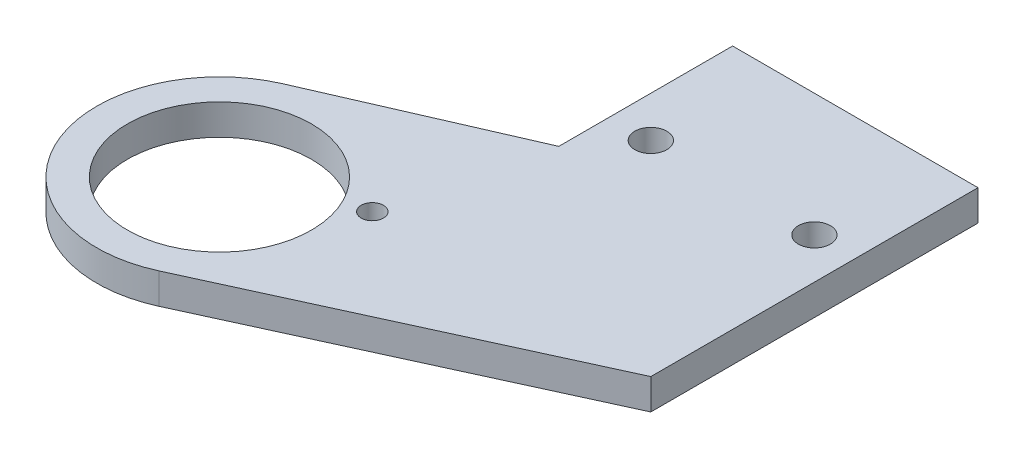
ISO-10303-21;
HEADER;
FILE_DESCRIPTION(('STEP AP214'),'2;1');
FILE_NAME('part.step','',(''),(''),'','','');
FILE_SCHEMA(('AUTOMOTIVE_DESIGN { 1 0 10303 214 1 1 1 1 }'));
ENDSEC;
DATA;
#1=APPLICATION_CONTEXT('core data for automotive mechanical design processes');
#2=APPLICATION_PROTOCOL_DEFINITION('international standard','automotive_design',2000,#1);
#3=PRODUCT_CONTEXT('',#1,'mechanical');
#4=PRODUCT('Part','Part','',(#3));
#5=PRODUCT_RELATED_PRODUCT_CATEGORY('part','',(#4));
#6=PRODUCT_DEFINITION_FORMATION('','',#4);
#7=PRODUCT_DEFINITION_CONTEXT('part definition',#1,'design');
#8=PRODUCT_DEFINITION('design','',#6,#7);
#9=PRODUCT_DEFINITION_SHAPE('','',#8);
#10=(LENGTH_UNIT() NAMED_UNIT(*) SI_UNIT(.MILLI.,.METRE.));
#11=(NAMED_UNIT(*) PLANE_ANGLE_UNIT() SI_UNIT($,.RADIAN.));
#12=(NAMED_UNIT(*) SI_UNIT($,.STERADIAN.) SOLID_ANGLE_UNIT());
#13=UNCERTAINTY_MEASURE_WITH_UNIT(LENGTH_MEASURE(1.E-05),#10,'distance_accuracy_value','');
#14=(GEOMETRIC_REPRESENTATION_CONTEXT(3) GLOBAL_UNCERTAINTY_ASSIGNED_CONTEXT((#13)) GLOBAL_UNIT_ASSIGNED_CONTEXT((#10,
#11,#12)) REPRESENTATION_CONTEXT('',''));
#15=CARTESIAN_POINT('',(0.,0.,0.));
#16=DIRECTION('',(0.,0.,1.));
#17=DIRECTION('',(1.,0.,0.));
#18=AXIS2_PLACEMENT_3D('',#15,#16,#17);
#19=CARTESIAN_POINT('',(-41.2750000000016,4.7625,57.450103217217));
#20=DIRECTION('',(0.,1.,0.));
#21=DIRECTION('',(0.,0.,1.));
#22=AXIS2_PLACEMENT_3D('',#19,#20,#21);
#23=PLANE('',#22);
#24=CARTESIAN_POINT('',(-12.7,4.7625,19.05));
#25=DIRECTION('',(0.,1.,0.));
#26=DIRECTION('',(0.,0.,1.));
#27=AXIS2_PLACEMENT_3D('',#24,#25,#26);
#28=CIRCLE('',#27,2.4892);
#29=CARTESIAN_POINT('',(-12.7,4.7625,21.5392));
#30=VERTEX_POINT('',#29);
#31=EDGE_CURVE('E207',#30,#30,#28,.T.);
#32=ORIENTED_EDGE('',*,*,#31,.F.);
#33=EDGE_LOOP('',(#32));
#34=FACE_BOUND('',#33,.T.);
#35=CARTESIAN_POINT('',(12.7,4.7625,19.05));
#36=DIRECTION('',(0.,1.,0.));
#37=DIRECTION('',(0.,0.,1.));
#38=AXIS2_PLACEMENT_3D('',#35,#36,#37);
#39=CIRCLE('',#38,2.4892);
#40=CARTESIAN_POINT('',(12.7,4.7625,21.5392));
#41=VERTEX_POINT('',#40);
#42=EDGE_CURVE('E211',#41,#41,#39,.T.);
#43=ORIENTED_EDGE('',*,*,#42,.F.);
#44=EDGE_LOOP('',(#43));
#45=FACE_BOUND('',#44,.T.);
#46=CARTESIAN_POINT('',(-24.7420119984577,4.7625,50.2469467049089));
#47=DIRECTION('',(0.,1.,0.));
#48=DIRECTION('',(0.,0.,1.));
#49=AXIS2_PLACEMENT_3D('',#46,#47,#48);
#50=CIRCLE('',#49,1.7272);
#51=CARTESIAN_POINT('',(-24.7420119984577,4.7625,51.9741467049089));
#52=VERTEX_POINT('',#51);
#53=EDGE_CURVE('E221',#52,#52,#50,.T.);
#54=ORIENTED_EDGE('',*,*,#53,.F.);
#55=EDGE_LOOP('',(#54));
#56=FACE_BOUND('',#55,.T.);
#57=CARTESIAN_POINT('',(-41.2750000000016,4.7625,57.450103217217));
#58=DIRECTION('',(0.,1.,0.));
#59=DIRECTION('',(0.,0.,1.));
#60=AXIS2_PLACEMENT_3D('',#57,#58,#59);
#61=CIRCLE('',#60,19.049999999999);
#62=CARTESIAN_POINT('',(-48.8839681468055,4.7625,39.9856792719251));
#63=VERTEX_POINT('',#62);
#64=CARTESIAN_POINT('',(-33.3414910142177,4.7625,74.769512421126));
#65=VERTEX_POINT('',#64);
#66=EDGE_CURVE('E149',#63,#65,#61,.T.);
#67=ORIENTED_EDGE('',*,*,#66,.T.);
#68=DIRECTION('',(0.909348972285523,0.,-0.41603418922399));
#69=VECTOR('',#68,1.);
#70=CARTESIAN_POINT('',(-33.3414910142177,4.7625,74.769512421126));
#71=LINE('',#70,#69);
#72=CARTESIAN_POINT('',(19.05,4.7625,50.8));
#73=VERTEX_POINT('',#72);
#74=EDGE_CURVE('E97',#65,#73,#71,.T.);
#75=ORIENTED_EDGE('',*,*,#74,.T.);
#76=DIRECTION('',(0.,0.,-1.));
#77=VECTOR('',#76,1.);
#78=CARTESIAN_POINT('',(19.05,4.7625,0.));
#79=LINE('',#78,#77);
#80=CARTESIAN_POINT('',(19.05,4.7625,0.));
#81=VERTEX_POINT('',#80);
#82=EDGE_CURVE('E110',#73,#81,#79,.T.);
#83=ORIENTED_EDGE('',*,*,#82,.T.);
#84=DIRECTION('',(-1.,0.,0.));
#85=VECTOR('',#84,1.);
#86=CARTESIAN_POINT('',(19.05,4.7625,0.));
#87=LINE('',#86,#85);
#88=CARTESIAN_POINT('',(-19.05,4.7625,0.));
#89=VERTEX_POINT('',#88);
#90=EDGE_CURVE('E104',#81,#89,#87,.T.);
#91=ORIENTED_EDGE('',*,*,#90,.T.);
#92=DIRECTION('',(0.,0.,1.));
#93=VECTOR('',#92,1.);
#94=CARTESIAN_POINT('',(-19.05,4.7625,0.));
#95=LINE('',#94,#93);
#96=CARTESIAN_POINT('',(-19.05,4.7625,26.9875));
#97=VERTEX_POINT('',#96);
#98=EDGE_CURVE('E108',#89,#97,#95,.T.);
#99=ORIENTED_EDGE('',*,*,#98,.T.);
#100=DIRECTION('',(-0.916767661170227,0.,0.399420900094715));
#101=VECTOR('',#100,1.);
#102=CARTESIAN_POINT('',(-19.05,4.7625,26.9875));
#103=LINE('',#102,#101);
#104=EDGE_CURVE('E60',#97,#63,#103,.T.);
#105=ORIENTED_EDGE('',*,*,#104,.T.);
#106=EDGE_LOOP('',(#67,#75,#83,#91,#99,#105));
#107=FACE_BOUND('',#106,.T.);
#108=CARTESIAN_POINT('',(-41.2750000000016,4.7625,57.450103217217));
#109=DIRECTION('',(0.,1.,0.));
#110=DIRECTION('',(0.,0.,1.));
#111=AXIS2_PLACEMENT_3D('',#108,#109,#110);
#112=CIRCLE('',#111,14.2875);
#113=CARTESIAN_POINT('',(-41.2750000000016,4.7625,43.162603217217));
#114=VERTEX_POINT('',#113);
#115=EDGE_CURVE('E137',#114,#114,#112,.T.);
#116=ORIENTED_EDGE('',*,*,#115,.F.);
#117=EDGE_LOOP('',(#116));
#118=FACE_BOUND('',#117,.T.);
#119=ADVANCED_FACE('F42',(#34,#45,#56,#107,#118),#23,.T.);
#120=CARTESIAN_POINT('',(-41.2750000000016,0.,57.450103217217));
#121=DIRECTION('',(0.,1.,0.));
#122=DIRECTION('',(0.,0.,1.));
#123=AXIS2_PLACEMENT_3D('',#120,#121,#122);
#124=PLANE('',#123);
#125=CARTESIAN_POINT('',(-12.7,0.,19.05));
#126=DIRECTION('',(0.,1.,0.));
#127=DIRECTION('',(0.,0.,1.));
#128=AXIS2_PLACEMENT_3D('',#125,#126,#127);
#129=CIRCLE('',#128,2.48919999999999);
#130=CARTESIAN_POINT('',(-12.7,0.,21.5392));
#131=VERTEX_POINT('',#130);
#132=EDGE_CURVE('E205',#131,#131,#129,.T.);
#133=ORIENTED_EDGE('',*,*,#132,.T.);
#134=EDGE_LOOP('',(#133));
#135=FACE_BOUND('',#134,.T.);
#136=CARTESIAN_POINT('',(12.7,0.,19.05));
#137=DIRECTION('',(0.,1.,0.));
#138=DIRECTION('',(0.,0.,1.));
#139=AXIS2_PLACEMENT_3D('',#136,#137,#138);
#140=CIRCLE('',#139,2.48919999999999);
#141=CARTESIAN_POINT('',(12.7,0.,21.5392));
#142=VERTEX_POINT('',#141);
#143=EDGE_CURVE('E217',#142,#142,#140,.T.);
#144=ORIENTED_EDGE('',*,*,#143,.T.);
#145=EDGE_LOOP('',(#144));
#146=FACE_BOUND('',#145,.T.);
#147=CARTESIAN_POINT('',(-24.7420119984577,0.,50.2469467049089));
#148=DIRECTION('',(0.,1.,0.));
#149=DIRECTION('',(0.,0.,1.));
#150=AXIS2_PLACEMENT_3D('',#147,#148,#149);
#151=CIRCLE('',#150,1.7272);
#152=CARTESIAN_POINT('',(-24.7420119984577,0.,51.9741467049089));
#153=VERTEX_POINT('',#152);
#154=EDGE_CURVE('E225',#153,#153,#151,.T.);
#155=ORIENTED_EDGE('',*,*,#154,.T.);
#156=EDGE_LOOP('',(#155));
#157=FACE_BOUND('',#156,.T.);
#158=CARTESIAN_POINT('',(-41.2750000000016,0.,57.450103217217));
#159=DIRECTION('',(0.,1.,0.));
#160=DIRECTION('',(0.,0.,1.));
#161=AXIS2_PLACEMENT_3D('',#158,#159,#160);
#162=CIRCLE('',#161,19.049999999999);
#163=CARTESIAN_POINT('',(-48.8839681468055,0.,39.9856792719251));
#164=VERTEX_POINT('',#163);
#165=CARTESIAN_POINT('',(-33.3414910142177,0.,74.769512421126));
#166=VERTEX_POINT('',#165);
#167=EDGE_CURVE('E132',#164,#166,#162,.T.);
#168=ORIENTED_EDGE('',*,*,#167,.F.);
#169=DIRECTION('',(-0.916767661170227,0.,0.399420900094715));
#170=VECTOR('',#169,1.);
#171=CARTESIAN_POINT('',(-19.05,0.,26.9875));
#172=LINE('',#171,#170);
#173=CARTESIAN_POINT('',(-19.05,0.,26.9875));
#174=VERTEX_POINT('',#173);
#175=EDGE_CURVE('E89',#174,#164,#172,.T.);
#176=ORIENTED_EDGE('',*,*,#175,.F.);
#177=DIRECTION('',(0.,0.,1.));
#178=VECTOR('',#177,1.);
#179=CARTESIAN_POINT('',(-19.05,0.,0.));
#180=LINE('',#179,#178);
#181=CARTESIAN_POINT('',(-19.05,0.,0.));
#182=VERTEX_POINT('',#181);
#183=EDGE_CURVE('E83',#182,#174,#180,.T.);
#184=ORIENTED_EDGE('',*,*,#183,.F.);
#185=DIRECTION('',(-1.,0.,0.));
#186=VECTOR('',#185,1.);
#187=CARTESIAN_POINT('',(19.05,0.,0.));
#188=LINE('',#187,#186);
#189=CARTESIAN_POINT('',(19.05,0.,0.));
#190=VERTEX_POINT('',#189);
#191=EDGE_CURVE('E119',#190,#182,#188,.T.);
#192=ORIENTED_EDGE('',*,*,#191,.F.);
#193=DIRECTION('',(0.,0.,-1.));
#194=VECTOR('',#193,1.);
#195=CARTESIAN_POINT('',(19.05,0.,0.));
#196=LINE('',#195,#194);
#197=CARTESIAN_POINT('',(19.05,0.,50.8));
#198=VERTEX_POINT('',#197);
#199=EDGE_CURVE('E140',#198,#190,#196,.T.);
#200=ORIENTED_EDGE('',*,*,#199,.F.);
#201=DIRECTION('',(0.909348972285523,0.,-0.41603418922399));
#202=VECTOR('',#201,1.);
#203=CARTESIAN_POINT('',(-33.3414910142177,0.,74.769512421126));
#204=LINE('',#203,#202);
#205=EDGE_CURVE('E136',#166,#198,#204,.T.);
#206=ORIENTED_EDGE('',*,*,#205,.F.);
#207=EDGE_LOOP('',(#168,#176,#184,#192,#200,#206));
#208=FACE_BOUND('',#207,.T.);
#209=CARTESIAN_POINT('',(-41.2750000000016,0.,57.450103217217));
#210=DIRECTION('',(0.,1.,0.));
#211=DIRECTION('',(0.,0.,1.));
#212=AXIS2_PLACEMENT_3D('',#209,#210,#211);
#213=CIRCLE('',#212,14.2875);
#214=CARTESIAN_POINT('',(-41.2750000000016,0.,43.162603217217));
#215=VERTEX_POINT('',#214);
#216=EDGE_CURVE('E229',#215,#215,#213,.T.);
#217=ORIENTED_EDGE('',*,*,#216,.T.);
#218=EDGE_LOOP('',(#217));
#219=FACE_BOUND('',#218,.T.);
#220=ADVANCED_FACE('F162',(#135,#146,#157,#208,#219),#124,.F.);
#221=CARTESIAN_POINT('',(-41.2750000000016,4.7625,57.450103217217));
#222=DIRECTION('',(0.,-1.,0.));
#223=DIRECTION('',(0.,0.,-1.));
#224=AXIS2_PLACEMENT_3D('',#221,#222,#223);
#225=CYLINDRICAL_SURFACE('',#224,19.049999999999);
#226=ORIENTED_EDGE('',*,*,#167,.T.);
#227=DIRECTION('',(0.,-1.,0.));
#228=VECTOR('',#227,1.);
#229=CARTESIAN_POINT('',(-33.3414910142177,4.7625,74.769512421126));
#230=LINE('',#229,#228);
#231=EDGE_CURVE('E11',#65,#166,#230,.T.);
#232=ORIENTED_EDGE('',*,*,#231,.F.);
#233=ORIENTED_EDGE('',*,*,#66,.F.);
#234=DIRECTION('',(0.,-1.,0.));
#235=VECTOR('',#234,1.);
#236=CARTESIAN_POINT('',(-48.8839681468055,4.7625,39.9856792719251));
#237=LINE('',#236,#235);
#238=EDGE_CURVE('E128',#63,#164,#237,.T.);
#239=ORIENTED_EDGE('',*,*,#238,.T.);
#240=EDGE_LOOP('',(#226,#232,#233,#239));
#241=FACE_BOUND('',#240,.T.);
#242=ADVANCED_FACE('F44',(#241),#225,.T.);
#243=CARTESIAN_POINT('',(-33.3414910142177,4.7625,74.769512421126));
#244=DIRECTION('',(-0.41603418922399,0.,-0.909348972285523));
#245=DIRECTION('',(-0.909348972285523,0.,0.41603418922399));
#246=AXIS2_PLACEMENT_3D('',#243,#244,#245);
#247=PLANE('',#246);
#248=ORIENTED_EDGE('',*,*,#205,.T.);
#249=DIRECTION('',(0.,-1.,0.));
#250=VECTOR('',#249,1.);
#251=CARTESIAN_POINT('',(19.05,4.7625,50.8));
#252=LINE('',#251,#250);
#253=EDGE_CURVE('E52',#73,#198,#252,.T.);
#254=ORIENTED_EDGE('',*,*,#253,.F.);
#255=ORIENTED_EDGE('',*,*,#74,.F.);
#256=ORIENTED_EDGE('',*,*,#231,.T.);
#257=EDGE_LOOP('',(#248,#254,#255,#256));
#258=FACE_BOUND('',#257,.T.);
#259=ADVANCED_FACE('F296',(#258),#247,.F.);
#260=CARTESIAN_POINT('',(19.05,4.7625,0.));
#261=DIRECTION('',(-1.,0.,0.));
#262=DIRECTION('',(0.,0.,1.));
#263=AXIS2_PLACEMENT_3D('',#260,#261,#262);
#264=PLANE('',#263);
#265=ORIENTED_EDGE('',*,*,#199,.T.);
#266=DIRECTION('',(0.,-1.,0.));
#267=VECTOR('',#266,1.);
#268=CARTESIAN_POINT('',(19.05,4.7625,0.));
#269=LINE('',#268,#267);
#270=EDGE_CURVE('E121',#81,#190,#269,.T.);
#271=ORIENTED_EDGE('',*,*,#270,.F.);
#272=ORIENTED_EDGE('',*,*,#82,.F.);
#273=ORIENTED_EDGE('',*,*,#253,.T.);
#274=EDGE_LOOP('',(#265,#271,#272,#273));
#275=FACE_BOUND('',#274,.T.);
#276=ADVANCED_FACE('F159',(#275),#264,.F.);
#277=CARTESIAN_POINT('',(19.05,4.7625,0.));
#278=DIRECTION('',(0.,0.,1.));
#279=DIRECTION('',(1.,0.,0.));
#280=AXIS2_PLACEMENT_3D('',#277,#278,#279);
#281=PLANE('',#280);
#282=ORIENTED_EDGE('',*,*,#191,.T.);
#283=DIRECTION('',(0.,-1.,0.));
#284=VECTOR('',#283,1.);
#285=CARTESIAN_POINT('',(-19.05,4.7625,0.));
#286=LINE('',#285,#284);
#287=EDGE_CURVE('E116',#89,#182,#286,.T.);
#288=ORIENTED_EDGE('',*,*,#287,.F.);
#289=ORIENTED_EDGE('',*,*,#90,.F.);
#290=ORIENTED_EDGE('',*,*,#270,.T.);
#291=EDGE_LOOP('',(#282,#288,#289,#290));
#292=FACE_BOUND('',#291,.T.);
#293=ADVANCED_FACE('F117',(#292),#281,.F.);
#294=CARTESIAN_POINT('',(-19.05,4.7625,0.));
#295=DIRECTION('',(1.,0.,0.));
#296=DIRECTION('',(0.,0.,-1.));
#297=AXIS2_PLACEMENT_3D('',#294,#295,#296);
#298=PLANE('',#297);
#299=ORIENTED_EDGE('',*,*,#183,.T.);
#300=DIRECTION('',(0.,-1.,0.));
#301=VECTOR('',#300,1.);
#302=CARTESIAN_POINT('',(-19.05,4.7625,26.9875));
#303=LINE('',#302,#301);
#304=EDGE_CURVE('E122',#97,#174,#303,.T.);
#305=ORIENTED_EDGE('',*,*,#304,.F.);
#306=ORIENTED_EDGE('',*,*,#98,.F.);
#307=ORIENTED_EDGE('',*,*,#287,.T.);
#308=EDGE_LOOP('',(#299,#305,#306,#307));
#309=FACE_BOUND('',#308,.T.);
#310=ADVANCED_FACE('F124',(#309),#298,.F.);
#311=CARTESIAN_POINT('',(-19.05,4.7625,26.9875));
#312=DIRECTION('',(0.399420900094715,0.,0.916767661170227));
#313=DIRECTION('',(0.916767661170227,0.,-0.399420900094715));
#314=AXIS2_PLACEMENT_3D('',#311,#312,#313);
#315=PLANE('',#314);
#316=ORIENTED_EDGE('',*,*,#175,.T.);
#317=ORIENTED_EDGE('',*,*,#238,.F.);
#318=ORIENTED_EDGE('',*,*,#104,.F.);
#319=ORIENTED_EDGE('',*,*,#304,.T.);
#320=EDGE_LOOP('',(#316,#317,#318,#319));
#321=FACE_BOUND('',#320,.T.);
#322=ADVANCED_FACE('F167',(#321),#315,.F.);
#323=CARTESIAN_POINT('',(-41.2750000000016,4.7625,57.450103217217));
#324=DIRECTION('',(0.,-1.,0.));
#325=DIRECTION('',(0.,0.,-1.));
#326=AXIS2_PLACEMENT_3D('',#323,#324,#325);
#327=CYLINDRICAL_SURFACE('',#326,14.2875);
#328=CARTESIAN_POINT('',(-41.2750000000016,4.7625,43.162603217217));
#329=CARTESIAN_POINT('',(-41.2750000000016,4.712890625,43.162603217217));
#330=CARTESIAN_POINT('',(-41.2750000000016,4.66328125,43.162603217217));
#331=CARTESIAN_POINT('',(-41.2750000000016,4.5640625,43.162603217217));
#332=CARTESIAN_POINT('',(-41.2750000000016,4.514453125,43.162603217217));
#333=CARTESIAN_POINT('',(-41.2750000000016,4.415234375,43.162603217217));
#334=CARTESIAN_POINT('',(-41.2750000000016,4.365625,43.162603217217));
#335=CARTESIAN_POINT('',(-41.2750000000016,4.26640625,43.162603217217));
#336=CARTESIAN_POINT('',(-41.2750000000016,4.216796875,43.162603217217));
#337=CARTESIAN_POINT('',(-41.2750000000016,4.117578125,43.162603217217));
#338=CARTESIAN_POINT('',(-41.2750000000016,4.06796875,43.162603217217));
#339=CARTESIAN_POINT('',(-41.2750000000016,3.96875,43.162603217217));
#340=CARTESIAN_POINT('',(-41.2750000000016,3.919140625,43.162603217217));
#341=CARTESIAN_POINT('',(-41.2750000000016,3.819921875,43.162603217217));
#342=CARTESIAN_POINT('',(-41.2750000000016,3.7703125,43.162603217217));
#343=CARTESIAN_POINT('',(-41.2750000000016,3.67109375,43.162603217217));
#344=CARTESIAN_POINT('',(-41.2750000000016,3.621484375,43.162603217217));
#345=CARTESIAN_POINT('',(-41.2750000000016,3.522265625,43.162603217217));
#346=CARTESIAN_POINT('',(-41.2750000000016,3.47265625,43.162603217217));
#347=CARTESIAN_POINT('',(-41.2750000000016,3.3734375,43.162603217217));
#348=CARTESIAN_POINT('',(-41.2750000000016,3.323828125,43.162603217217));
#349=CARTESIAN_POINT('',(-41.2750000000016,3.224609375,43.162603217217));
#350=CARTESIAN_POINT('',(-41.2750000000016,3.175,43.162603217217));
#351=CARTESIAN_POINT('',(-41.2750000000016,3.07578125,43.162603217217));
#352=CARTESIAN_POINT('',(-41.2750000000016,3.026171875,43.162603217217));
#353=CARTESIAN_POINT('',(-41.2750000000016,2.926953125,43.162603217217));
#354=CARTESIAN_POINT('',(-41.2750000000016,2.87734375,43.162603217217));
#355=CARTESIAN_POINT('',(-41.2750000000016,2.778125,43.162603217217));
#356=CARTESIAN_POINT('',(-41.2750000000016,2.728515625,43.162603217217));
#357=CARTESIAN_POINT('',(-41.2750000000016,2.629296875,43.162603217217));
#358=CARTESIAN_POINT('',(-41.2750000000016,2.5796875,43.162603217217));
#359=CARTESIAN_POINT('',(-41.2750000000016,2.48046875,43.162603217217));
#360=CARTESIAN_POINT('',(-41.2750000000016,2.430859375,43.162603217217));
#361=CARTESIAN_POINT('',(-41.2750000000016,2.331640625,43.162603217217));
#362=CARTESIAN_POINT('',(-41.2750000000016,2.28203125,43.162603217217));
#363=CARTESIAN_POINT('',(-41.2750000000016,2.1828125,43.162603217217));
#364=CARTESIAN_POINT('',(-41.2750000000016,2.133203125,43.162603217217));
#365=CARTESIAN_POINT('',(-41.2750000000016,2.033984375,43.162603217217));
#366=CARTESIAN_POINT('',(-41.2750000000016,1.984375,43.162603217217));
#367=CARTESIAN_POINT('',(-41.2750000000016,1.88515625,43.162603217217));
#368=CARTESIAN_POINT('',(-41.2750000000016,1.835546875,43.162603217217));
#369=CARTESIAN_POINT('',(-41.2750000000016,1.736328125,43.162603217217));
#370=CARTESIAN_POINT('',(-41.2750000000016,1.68671875,43.162603217217));
#371=CARTESIAN_POINT('',(-41.2750000000016,1.5875,43.162603217217));
#372=CARTESIAN_POINT('',(-41.2750000000016,1.537890625,43.162603217217));
#373=CARTESIAN_POINT('',(-41.2750000000016,1.438671875,43.162603217217));
#374=CARTESIAN_POINT('',(-41.2750000000016,1.3890625,43.162603217217));
#375=CARTESIAN_POINT('',(-41.2750000000016,1.28984375,43.162603217217));
#376=CARTESIAN_POINT('',(-41.2750000000016,1.240234375,43.162603217217));
#377=CARTESIAN_POINT('',(-41.2750000000016,1.141015625,43.162603217217));
#378=CARTESIAN_POINT('',(-41.2750000000016,1.09140625,43.162603217217));
#379=CARTESIAN_POINT('',(-41.2750000000016,0.9921875,43.162603217217));
#380=CARTESIAN_POINT('',(-41.2750000000016,0.942578125,43.162603217217));
#381=CARTESIAN_POINT('',(-41.2750000000016,0.843359375,43.162603217217));
#382=CARTESIAN_POINT('',(-41.2750000000016,0.79375,43.162603217217));
#383=CARTESIAN_POINT('',(-41.2750000000016,0.69453125,43.162603217217));
#384=CARTESIAN_POINT('',(-41.2750000000016,0.644921875,43.162603217217));
#385=CARTESIAN_POINT('',(-41.2750000000016,0.545703125,43.162603217217));
#386=CARTESIAN_POINT('',(-41.2750000000016,0.49609375,43.162603217217));
#387=CARTESIAN_POINT('',(-41.2750000000016,0.396875,43.162603217217));
#388=CARTESIAN_POINT('',(-41.2750000000016,0.347265625,43.162603217217));
#389=CARTESIAN_POINT('',(-41.2750000000016,0.248046875,43.162603217217));
#390=CARTESIAN_POINT('',(-41.2750000000016,0.1984375,43.162603217217));
#391=CARTESIAN_POINT('',(-41.2750000000016,0.09921875,43.162603217217));
#392=CARTESIAN_POINT('',(-41.2750000000016,0.049609375,43.162603217217));
#393=CARTESIAN_POINT('',(-41.2750000000016,0.,43.162603217217));
#394=B_SPLINE_CURVE_WITH_KNOTS('',3,(#328,#329,#330,#331,#332,#333,#334,#335,#336,#337,#338,
#339,#340,#341,#342,#343,#344,#345,#346,#347,#348,#349,#350,#351,#352,#353,#354,#355,#356,#357,
#358,#359,#360,#361,#362,#363,#364,#365,#366,#367,#368,#369,#370,#371,#372,#373,#374,#375,#376,
#377,#378,#379,#380,#381,#382,#383,#384,#385,#386,#387,#388,#389,#390,#391,#392,#393),
.UNSPECIFIED.,.F.,.F.,(4,2,2,2,2,2,2,2,2,2,2,2,2,2,2,2,2,2,2,2,2,2,2,2,2,2,2,2,2,2,2,2,4),(0.,
0.148828124999999,0.297656249999999,0.446484374999999,0.595312499999999,0.744140625,0.89296875,
1.041796875,1.190625,1.339453125,1.48828125,1.637109375,1.7859375,1.934765625,2.08359375,
2.232421875,2.38125,2.530078125,2.67890625,2.827734375,2.9765625,3.125390625,3.27421875,
3.423046875,3.571875,3.720703125,3.86953125,4.018359375,4.1671875,4.316015625,4.46484375,
4.613671875,4.7625),.UNSPECIFIED.);
#395=EDGE_CURVE('BSEAM169',#114,#215,#394,.T.);
#396=ORIENTED_EDGE('',*,*,#115,.T.);
#397=ORIENTED_EDGE('',*,*,#216,.F.);
#398=ORIENTED_EDGE('',*,*,#395,.T.);
#399=ORIENTED_EDGE('',*,*,#395,.F.);
#400=EDGE_LOOP('',(#396,#398,#397,#399));
#401=FACE_BOUND('',#400,.T.);
#402=ADVANCED_FACE('F169',(#401),#327,.F.);
#403=CARTESIAN_POINT('',(-24.7420119984577,4.7625,50.2469467049089));
#404=DIRECTION('',(0.,1.,0.));
#405=DIRECTION('',(0.,0.,1.));
#406=AXIS2_PLACEMENT_3D('',#403,#404,#405);
#407=CYLINDRICAL_SURFACE('',#406,1.7272);
#408=ORIENTED_EDGE('',*,*,#154,.F.);
#409=EDGE_LOOP('',(#408));
#410=FACE_BOUND('',#409,.T.);
#411=ORIENTED_EDGE('',*,*,#53,.T.);
#412=EDGE_LOOP('',(#411));
#413=FACE_BOUND('',#412,.T.);
#414=ADVANCED_FACE('F175',(#410,#413),#407,.F.);
#415=CARTESIAN_POINT('',(12.7,4.7625,19.05));
#416=DIRECTION('',(0.,1.,0.));
#417=DIRECTION('',(0.,0.,1.));
#418=AXIS2_PLACEMENT_3D('',#415,#416,#417);
#419=CYLINDRICAL_SURFACE('',#418,2.4892);
#420=ORIENTED_EDGE('',*,*,#143,.F.);
#421=EDGE_LOOP('',(#420));
#422=FACE_BOUND('',#421,.T.);
#423=ORIENTED_EDGE('',*,*,#42,.T.);
#424=EDGE_LOOP('',(#423));
#425=FACE_BOUND('',#424,.T.);
#426=ADVANCED_FACE('F192',(#422,#425),#419,.F.);
#427=CARTESIAN_POINT('',(-12.7,4.7625,19.05));
#428=DIRECTION('',(0.,1.,0.));
#429=DIRECTION('',(0.,0.,1.));
#430=AXIS2_PLACEMENT_3D('',#427,#428,#429);
#431=CYLINDRICAL_SURFACE('',#430,2.4892);
#432=ORIENTED_EDGE('',*,*,#132,.F.);
#433=EDGE_LOOP('',(#432));
#434=FACE_BOUND('',#433,.T.);
#435=ORIENTED_EDGE('',*,*,#31,.T.);
#436=EDGE_LOOP('',(#435));
#437=FACE_BOUND('',#436,.T.);
#438=ADVANCED_FACE('F196',(#434,#437),#431,.F.);
#439=CLOSED_SHELL('',(#119,#220,#242,#259,#276,#293,#310,#322,#402,#414,#426,#438));
#440=MANIFOLD_SOLID_BREP('B2',#439);
#441=ADVANCED_BREP_SHAPE_REPRESENTATION('',(#18,#440),#14);
#442=SHAPE_DEFINITION_REPRESENTATION(#9,#441);
ENDSEC;
END-ISO-10303-21;
